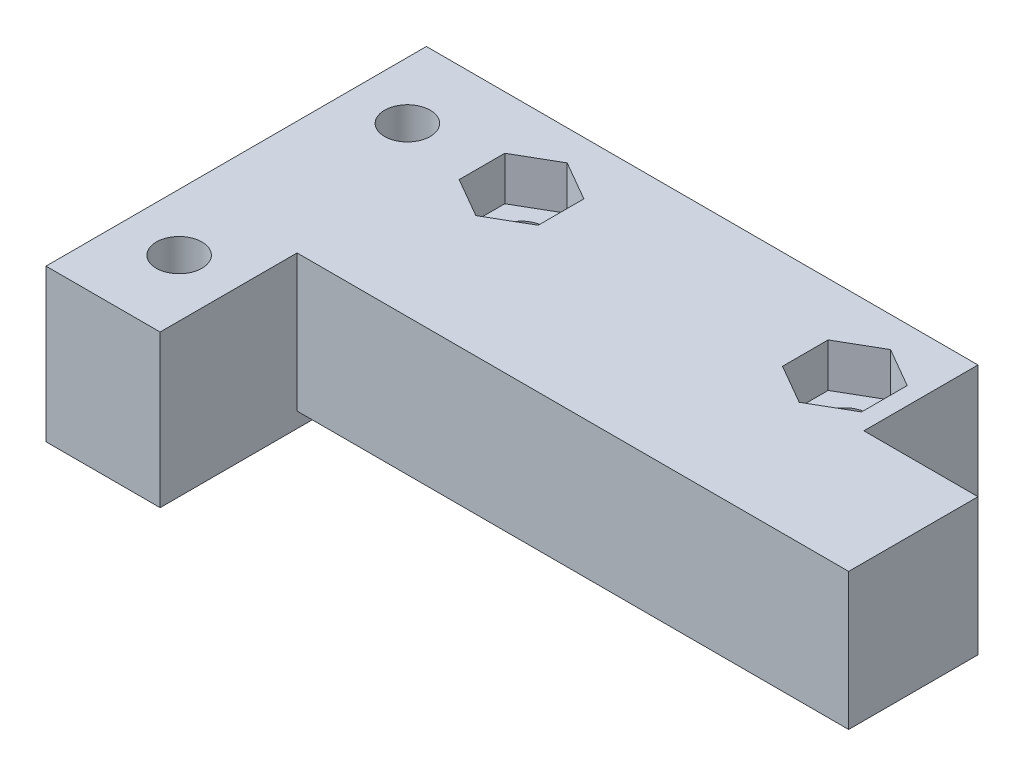
ISO-10303-21;
HEADER;
FILE_DESCRIPTION(('STEP AP214'),'2;1');
FILE_NAME('part.step','',(''),(''),'','','');
FILE_SCHEMA(('AUTOMOTIVE_DESIGN { 1 0 10303 214 1 1 1 1 }'));
ENDSEC;
DATA;
#1=APPLICATION_CONTEXT('core data for automotive mechanical design processes');
#2=APPLICATION_PROTOCOL_DEFINITION('international standard','automotive_design',2000,#1);
#3=PRODUCT_CONTEXT('',#1,'mechanical');
#4=PRODUCT('Part','Part','',(#3));
#5=PRODUCT_RELATED_PRODUCT_CATEGORY('part','',(#4));
#6=PRODUCT_DEFINITION_FORMATION('','',#4);
#7=PRODUCT_DEFINITION_CONTEXT('part definition',#1,'design');
#8=PRODUCT_DEFINITION('design','',#6,#7);
#9=PRODUCT_DEFINITION_SHAPE('','',#8);
#10=(LENGTH_UNIT() NAMED_UNIT(*) SI_UNIT(.MILLI.,.METRE.));
#11=(NAMED_UNIT(*) PLANE_ANGLE_UNIT() SI_UNIT($,.RADIAN.));
#12=(NAMED_UNIT(*) SI_UNIT($,.STERADIAN.) SOLID_ANGLE_UNIT());
#13=UNCERTAINTY_MEASURE_WITH_UNIT(LENGTH_MEASURE(1.E-05),#10,'distance_accuracy_value','');
#14=(GEOMETRIC_REPRESENTATION_CONTEXT(3) GLOBAL_UNCERTAINTY_ASSIGNED_CONTEXT((#13)) GLOBAL_UNIT_ASSIGNED_CONTEXT((#10,
#11,#12)) REPRESENTATION_CONTEXT('',''));
#15=CARTESIAN_POINT('',(0.,0.,0.));
#16=DIRECTION('',(0.,0.,1.));
#17=DIRECTION('',(1.,0.,0.));
#18=AXIS2_PLACEMENT_3D('',#15,#16,#17);
#19=CARTESIAN_POINT('',(3.,8.,-16.));
#20=DIRECTION('',(0.,-1.,0.));
#21=DIRECTION('',(0.,0.,-1.));
#22=AXIS2_PLACEMENT_3D('',#19,#20,#21);
#23=CYLINDRICAL_SURFACE('',#22,1.2);
#24=CARTESIAN_POINT('',(3.,8.,-16.));
#25=DIRECTION('',(0.,1.,0.));
#26=DIRECTION('',(0.,0.,1.));
#27=AXIS2_PLACEMENT_3D('',#24,#25,#26);
#28=CIRCLE('',#27,1.2);
#29=CARTESIAN_POINT('',(3.,8.,-14.8));
#30=VERTEX_POINT('',#29);
#31=EDGE_CURVE('E296',#30,#30,#28,.T.);
#32=ORIENTED_EDGE('',*,*,#31,.T.);
#33=EDGE_LOOP('',(#32));
#34=FACE_BOUND('',#33,.T.);
#35=CARTESIAN_POINT('',(3.,2.,-16.));
#36=DIRECTION('',(0.,-1.,0.));
#37=DIRECTION('',(0.,0.,-1.));
#38=AXIS2_PLACEMENT_3D('',#35,#36,#37);
#39=CIRCLE('',#38,1.2);
#40=CARTESIAN_POINT('',(3.,2.,-17.2));
#41=VERTEX_POINT('',#40);
#42=EDGE_CURVE('E37',#41,#41,#39,.T.);
#43=ORIENTED_EDGE('',*,*,#42,.T.);
#44=EDGE_LOOP('',(#43));
#45=FACE_BOUND('',#44,.T.);
#46=ADVANCED_FACE('F33',(#34,#45),#23,.F.);
#47=CARTESIAN_POINT('',(3.,8.,-4.));
#48=DIRECTION('',(0.,-1.,0.));
#49=DIRECTION('',(0.,0.,-1.));
#50=AXIS2_PLACEMENT_3D('',#47,#48,#49);
#51=CYLINDRICAL_SURFACE('',#50,1.2);
#52=CARTESIAN_POINT('',(3.,8.,-4.));
#53=DIRECTION('',(0.,1.,0.));
#54=DIRECTION('',(0.,0.,1.));
#55=AXIS2_PLACEMENT_3D('',#52,#53,#54);
#56=CIRCLE('',#55,1.2);
#57=CARTESIAN_POINT('',(3.,8.,-2.8));
#58=VERTEX_POINT('',#57);
#59=EDGE_CURVE('E293',#58,#58,#56,.T.);
#60=ORIENTED_EDGE('',*,*,#59,.T.);
#61=EDGE_LOOP('',(#60));
#62=FACE_BOUND('',#61,.T.);
#63=CARTESIAN_POINT('',(3.,2.,-4.));
#64=DIRECTION('',(0.,-1.,0.));
#65=DIRECTION('',(0.,0.,-1.));
#66=AXIS2_PLACEMENT_3D('',#63,#64,#65);
#67=CIRCLE('',#66,1.2);
#68=CARTESIAN_POINT('',(3.,2.,-5.2));
#69=VERTEX_POINT('',#68);
#70=EDGE_CURVE('E220',#69,#69,#67,.T.);
#71=ORIENTED_EDGE('',*,*,#70,.T.);
#72=EDGE_LOOP('',(#71));
#73=FACE_BOUND('',#72,.T.);
#74=ADVANCED_FACE('F404',(#62,#73),#51,.F.);
#75=CARTESIAN_POINT('',(26.,8.,-16.));
#76=DIRECTION('',(0.,-1.,0.));
#77=DIRECTION('',(0.,0.,-1.));
#78=AXIS2_PLACEMENT_3D('',#75,#76,#77);
#79=CYLINDRICAL_SURFACE('',#78,1.2);
#80=CARTESIAN_POINT('',(26.,0.,-16.));
#81=DIRECTION('',(0.,1.,0.));
#82=DIRECTION('',(0.,0.,1.));
#83=AXIS2_PLACEMENT_3D('',#80,#81,#82);
#84=CIRCLE('',#83,1.2);
#85=CARTESIAN_POINT('',(26.,0.,-14.8));
#86=VERTEX_POINT('',#85);
#87=EDGE_CURVE('E287',#86,#86,#84,.T.);
#88=ORIENTED_EDGE('',*,*,#87,.F.);
#89=EDGE_LOOP('',(#88));
#90=FACE_BOUND('',#89,.T.);
#91=CARTESIAN_POINT('',(26.,5.7,-16.));
#92=DIRECTION('',(0.,1.,0.));
#93=DIRECTION('',(0.,0.,1.));
#94=AXIS2_PLACEMENT_3D('',#91,#92,#93);
#95=CIRCLE('',#94,1.2);
#96=CARTESIAN_POINT('',(26.,5.7,-14.8));
#97=VERTEX_POINT('',#96);
#98=EDGE_CURVE('E232',#97,#97,#95,.T.);
#99=ORIENTED_EDGE('',*,*,#98,.T.);
#100=EDGE_LOOP('',(#99));
#101=FACE_BOUND('',#100,.T.);
#102=ADVANCED_FACE('F410',(#90,#101),#79,.F.);
#103=CARTESIAN_POINT('',(9.,8.,-16.));
#104=DIRECTION('',(0.,-1.,0.));
#105=DIRECTION('',(0.,0.,-1.));
#106=AXIS2_PLACEMENT_3D('',#103,#104,#105);
#107=CYLINDRICAL_SURFACE('',#106,1.2);
#108=CARTESIAN_POINT('',(9.,0.,-16.));
#109=DIRECTION('',(0.,1.,0.));
#110=DIRECTION('',(0.,0.,1.));
#111=AXIS2_PLACEMENT_3D('',#108,#109,#110);
#112=CIRCLE('',#111,1.2);
#113=CARTESIAN_POINT('',(9.,0.,-14.8));
#114=VERTEX_POINT('',#113);
#115=EDGE_CURVE('E290',#114,#114,#112,.T.);
#116=ORIENTED_EDGE('',*,*,#115,.F.);
#117=EDGE_LOOP('',(#116));
#118=FACE_BOUND('',#117,.T.);
#119=CARTESIAN_POINT('',(9.,5.7,-16.));
#120=DIRECTION('',(0.,1.,0.));
#121=DIRECTION('',(0.,0.,1.));
#122=AXIS2_PLACEMENT_3D('',#119,#120,#121);
#123=CIRCLE('',#122,1.2);
#124=CARTESIAN_POINT('',(9.,5.7,-14.8));
#125=VERTEX_POINT('',#124);
#126=EDGE_CURVE('E277',#125,#125,#123,.T.);
#127=ORIENTED_EDGE('',*,*,#126,.T.);
#128=EDGE_LOOP('',(#127));
#129=FACE_BOUND('',#128,.T.);
#130=ADVANCED_FACE('F446',(#118,#129),#107,.F.);
#131=CARTESIAN_POINT('',(0.,8.,0.));
#132=DIRECTION('',(0.,-1.,0.));
#133=DIRECTION('',(0.,0.,-1.));
#134=AXIS2_PLACEMENT_3D('',#131,#132,#133);
#135=PLANE('',#134);
#136=DIRECTION('',(-0.866025403784439,0.,0.5));
#137=VECTOR('',#136,1.);
#138=CARTESIAN_POINT('',(-1.46743371481683,8.,-2.5416697508023));
#139=LINE('',#138,#137);
#140=CARTESIAN_POINT('',(26.,8.,-18.4));
#141=VERTEX_POINT('',#140);
#142=CARTESIAN_POINT('',(23.9215390309173,8.,-17.2));
#143=VERTEX_POINT('',#142);
#144=EDGE_CURVE('E219',#141,#143,#139,.T.);
#145=ORIENTED_EDGE('',*,*,#144,.F.);
#146=DIRECTION('',(-0.866025403784439,0.,-0.499999999999999));
#147=VECTOR('',#146,1.);
#148=CARTESIAN_POINT('',(14.4674337148168,8.,-25.0583302491977));
#149=LINE('',#148,#147);
#150=CARTESIAN_POINT('',(28.0784609690827,8.,-17.2));
#151=VERTEX_POINT('',#150);
#152=EDGE_CURVE('E50',#151,#141,#149,.T.);
#153=ORIENTED_EDGE('',*,*,#152,.F.);
#154=DIRECTION('',(0.,0.,-1.));
#155=VECTOR('',#154,1.);
#156=CARTESIAN_POINT('',(28.0784609690827,8.,0.));
#157=LINE('',#156,#155);
#158=CARTESIAN_POINT('',(28.0784609690827,8.,-14.8));
#159=VERTEX_POINT('',#158);
#160=EDGE_CURVE('E202',#159,#151,#157,.T.);
#161=ORIENTED_EDGE('',*,*,#160,.F.);
#162=DIRECTION('',(0.866025403784439,0.,-0.5));
#163=VECTOR('',#162,1.);
#164=CARTESIAN_POINT('',(0.611027254265822,8.,1.05833024919771));
#165=LINE('',#164,#163);
#166=CARTESIAN_POINT('',(26.,8.,-13.6));
#167=VERTEX_POINT('',#166);
#168=EDGE_CURVE('E205',#167,#159,#165,.T.);
#169=ORIENTED_EDGE('',*,*,#168,.F.);
#170=DIRECTION('',(0.866025403784439,0.,0.499999999999999));
#171=VECTOR('',#170,1.);
#172=CARTESIAN_POINT('',(12.3889727457342,8.,-21.4583302491977));
#173=LINE('',#172,#171);
#174=CARTESIAN_POINT('',(23.9215390309173,8.,-14.8));
#175=VERTEX_POINT('',#174);
#176=EDGE_CURVE('E225',#175,#167,#173,.T.);
#177=ORIENTED_EDGE('',*,*,#176,.F.);
#178=DIRECTION('',(0.,0.,1.));
#179=VECTOR('',#178,1.);
#180=CARTESIAN_POINT('',(23.9215390309173,8.,0.));
#181=LINE('',#180,#179);
#182=EDGE_CURVE('E222',#143,#175,#181,.T.);
#183=ORIENTED_EDGE('',*,*,#182,.F.);
#184=EDGE_LOOP('',(#145,#153,#161,#169,#177,#183));
#185=FACE_BOUND('',#184,.T.);
#186=DIRECTION('',(-0.866025403784439,0.,0.5));
#187=VECTOR('',#186,1.);
#188=CARTESIAN_POINT('',(-5.71743371481683,8.,-9.90288568297003));
#189=LINE('',#188,#187);
#190=CARTESIAN_POINT('',(9.00000000000001,8.,-18.4));
#191=VERTEX_POINT('',#190);
#192=CARTESIAN_POINT('',(6.92153903091735,8.,-17.2));
#193=VERTEX_POINT('',#192);
#194=EDGE_CURVE('E261',#191,#193,#189,.T.);
#195=ORIENTED_EDGE('',*,*,#194,.F.);
#196=DIRECTION('',(-0.866025403784438,0.,-0.500000000000002));
#197=VECTOR('',#196,1.);
#198=CARTESIAN_POINT('',(10.2174337148169,8.,-17.6971143170299));
#199=LINE('',#198,#197);
#200=CARTESIAN_POINT('',(11.0784609690827,8.,-17.2));
#201=VERTEX_POINT('',#200);
#202=EDGE_CURVE('E58',#201,#191,#199,.T.);
#203=ORIENTED_EDGE('',*,*,#202,.F.);
#204=DIRECTION('',(0.,0.,-1.));
#205=VECTOR('',#204,1.);
#206=CARTESIAN_POINT('',(11.0784609690827,8.,0.));
#207=LINE('',#206,#205);
#208=CARTESIAN_POINT('',(11.0784609690827,8.,-14.8));
#209=VERTEX_POINT('',#208);
#210=EDGE_CURVE('E244',#209,#201,#207,.T.);
#211=ORIENTED_EDGE('',*,*,#210,.F.);
#212=DIRECTION('',(0.866025403784439,0.,-0.5));
#213=VECTOR('',#212,1.);
#214=CARTESIAN_POINT('',(-3.63897274573418,8.,-6.30288568297002));
#215=LINE('',#214,#213);
#216=CARTESIAN_POINT('',(9.00000000000001,8.,-13.6));
#217=VERTEX_POINT('',#216);
#218=EDGE_CURVE('E270',#217,#209,#215,.T.);
#219=ORIENTED_EDGE('',*,*,#218,.F.);
#220=DIRECTION('',(0.866025403784438,0.,0.5));
#221=VECTOR('',#220,1.);
#222=CARTESIAN_POINT('',(8.13897274573419,8.,-14.09711431703));
#223=LINE('',#222,#221);
#224=CARTESIAN_POINT('',(6.92153903091735,8.,-14.8));
#225=VERTEX_POINT('',#224);
#226=EDGE_CURVE('E267',#225,#217,#223,.T.);
#227=ORIENTED_EDGE('',*,*,#226,.F.);
#228=DIRECTION('',(0.,0.,1.));
#229=VECTOR('',#228,1.);
#230=CARTESIAN_POINT('',(6.92153903091735,8.,0.));
#231=LINE('',#230,#229);
#232=EDGE_CURVE('E264',#193,#225,#231,.T.);
#233=ORIENTED_EDGE('',*,*,#232,.F.);
#234=EDGE_LOOP('',(#195,#203,#211,#219,#227,#233));
#235=FACE_BOUND('',#234,.T.);
#236=ORIENTED_EDGE('',*,*,#31,.F.);
#237=EDGE_LOOP('',(#236));
#238=FACE_BOUND('',#237,.T.);
#239=DIRECTION('',(0.,0.,1.));
#240=VECTOR('',#239,1.);
#241=CARTESIAN_POINT('',(29.,8.,-20.));
#242=LINE('',#241,#240);
#243=CARTESIAN_POINT('',(29.,8.,-20.));
#244=VERTEX_POINT('',#243);
#245=CARTESIAN_POINT('',(29.,8.,-14.));
#246=VERTEX_POINT('',#245);
#247=EDGE_CURVE('E300',#244,#246,#242,.T.);
#248=ORIENTED_EDGE('',*,*,#247,.F.);
#249=DIRECTION('',(-1.,0.,0.));
#250=VECTOR('',#249,1.);
#251=CARTESIAN_POINT('',(0.,8.,-20.));
#252=LINE('',#251,#250);
#253=CARTESIAN_POINT('',(0.,8.,-20.));
#254=VERTEX_POINT('',#253);
#255=EDGE_CURVE('E354',#244,#254,#252,.T.);
#256=ORIENTED_EDGE('',*,*,#255,.T.);
#257=DIRECTION('',(0.,0.,1.));
#258=VECTOR('',#257,1.);
#259=CARTESIAN_POINT('',(0.,8.,0.));
#260=LINE('',#259,#258);
#261=CARTESIAN_POINT('',(0.,8.,0.));
#262=VERTEX_POINT('',#261);
#263=EDGE_CURVE('E344',#254,#262,#260,.T.);
#264=ORIENTED_EDGE('',*,*,#263,.T.);
#265=DIRECTION('',(1.,0.,0.));
#266=VECTOR('',#265,1.);
#267=CARTESIAN_POINT('',(0.,8.,0.));
#268=LINE('',#267,#266);
#269=CARTESIAN_POINT('',(6.,8.,0.));
#270=VERTEX_POINT('',#269);
#271=EDGE_CURVE('E347',#262,#270,#268,.T.);
#272=ORIENTED_EDGE('',*,*,#271,.T.);
#273=DIRECTION('',(0.,0.,1.));
#274=VECTOR('',#273,1.);
#275=CARTESIAN_POINT('',(6.,8.,0.));
#276=LINE('',#275,#274);
#277=CARTESIAN_POINT('',(6.,8.,-7.2));
#278=VERTEX_POINT('',#277);
#279=EDGE_CURVE('E313',#278,#270,#276,.T.);
#280=ORIENTED_EDGE('',*,*,#279,.F.);
#281=DIRECTION('',(-1.,0.,0.));
#282=VECTOR('',#281,1.);
#283=CARTESIAN_POINT('',(6.,8.,-7.2));
#284=LINE('',#283,#282);
#285=CARTESIAN_POINT('',(35.,8.,-7.2));
#286=VERTEX_POINT('',#285);
#287=EDGE_CURVE('E316',#286,#278,#284,.T.);
#288=ORIENTED_EDGE('',*,*,#287,.F.);
#289=DIRECTION('',(0.,0.,-1.));
#290=VECTOR('',#289,1.);
#291=CARTESIAN_POINT('',(35.,8.,0.));
#292=LINE('',#291,#290);
#293=CARTESIAN_POINT('',(35.,8.,-14.));
#294=VERTEX_POINT('',#293);
#295=EDGE_CURVE('E351',#286,#294,#292,.T.);
#296=ORIENTED_EDGE('',*,*,#295,.T.);
#297=DIRECTION('',(1.,0.,0.));
#298=VECTOR('',#297,1.);
#299=CARTESIAN_POINT('',(35.,8.,-14.));
#300=LINE('',#299,#298);
#301=EDGE_CURVE('E302',#246,#294,#300,.T.);
#302=ORIENTED_EDGE('',*,*,#301,.F.);
#303=EDGE_LOOP('',(#248,#256,#264,#272,#280,#288,#296,#302));
#304=FACE_BOUND('',#303,.T.);
#305=ORIENTED_EDGE('',*,*,#59,.F.);
#306=EDGE_LOOP('',(#305));
#307=FACE_BOUND('',#306,.T.);
#308=ADVANCED_FACE('F442',(#185,#235,#238,#304,#307),#135,.F.);
#309=CARTESIAN_POINT('',(0.,0.,0.));
#310=DIRECTION('',(0.,-1.,0.));
#311=DIRECTION('',(0.,0.,-1.));
#312=AXIS2_PLACEMENT_3D('',#309,#310,#311);
#313=PLANE('',#312);
#314=CARTESIAN_POINT('',(3.,0.,-16.));
#315=DIRECTION('',(0.,-1.,0.));
#316=DIRECTION('',(0.,0.,-1.));
#317=AXIS2_PLACEMENT_3D('',#314,#315,#316);
#318=CIRCLE('',#317,2.2);
#319=CARTESIAN_POINT('',(3.,0.,-18.2));
#320=VERTEX_POINT('',#319);
#321=EDGE_CURVE('E382',#320,#320,#318,.T.);
#322=ORIENTED_EDGE('',*,*,#321,.F.);
#323=EDGE_LOOP('',(#322));
#324=FACE_BOUND('',#323,.T.);
#325=CARTESIAN_POINT('',(3.,0.,-4.));
#326=DIRECTION('',(0.,-1.,0.));
#327=DIRECTION('',(0.,0.,-1.));
#328=AXIS2_PLACEMENT_3D('',#325,#326,#327);
#329=CIRCLE('',#328,2.2);
#330=CARTESIAN_POINT('',(3.,0.,-6.2));
#331=VERTEX_POINT('',#330);
#332=EDGE_CURVE('E208',#331,#331,#329,.T.);
#333=ORIENTED_EDGE('',*,*,#332,.F.);
#334=EDGE_LOOP('',(#333));
#335=FACE_BOUND('',#334,.T.);
#336=ORIENTED_EDGE('',*,*,#115,.T.);
#337=EDGE_LOOP('',(#336));
#338=FACE_BOUND('',#337,.T.);
#339=DIRECTION('',(-1.,0.,0.));
#340=VECTOR('',#339,1.);
#341=CARTESIAN_POINT('',(0.,0.,-20.));
#342=LINE('',#341,#340);
#343=CARTESIAN_POINT('',(29.,0.,-20.));
#344=VERTEX_POINT('',#343);
#345=CARTESIAN_POINT('',(0.,0.,-20.));
#346=VERTEX_POINT('',#345);
#347=EDGE_CURVE('E348',#344,#346,#342,.T.);
#348=ORIENTED_EDGE('',*,*,#347,.F.);
#349=DIRECTION('',(0.,0.,1.));
#350=VECTOR('',#349,1.);
#351=CARTESIAN_POINT('',(29.,0.,-20.));
#352=LINE('',#351,#350);
#353=CARTESIAN_POINT('',(29.,0.,-14.));
#354=VERTEX_POINT('',#353);
#355=EDGE_CURVE('E299',#344,#354,#352,.T.);
#356=ORIENTED_EDGE('',*,*,#355,.T.);
#357=DIRECTION('',(-1.,0.,0.));
#358=VECTOR('',#357,1.);
#359=CARTESIAN_POINT('',(6.,0.,-14.));
#360=LINE('',#359,#358);
#361=CARTESIAN_POINT('',(6.,0.,-14.));
#362=VERTEX_POINT('',#361);
#363=EDGE_CURVE('E328',#354,#362,#360,.T.);
#364=ORIENTED_EDGE('',*,*,#363,.T.);
#365=DIRECTION('',(0.,0.,1.));
#366=VECTOR('',#365,1.);
#367=CARTESIAN_POINT('',(6.,0.,0.));
#368=LINE('',#367,#366);
#369=CARTESIAN_POINT('',(6.,0.,0.));
#370=VERTEX_POINT('',#369);
#371=EDGE_CURVE('E323',#362,#370,#368,.T.);
#372=ORIENTED_EDGE('',*,*,#371,.T.);
#373=DIRECTION('',(1.,0.,0.));
#374=VECTOR('',#373,1.);
#375=CARTESIAN_POINT('',(0.,0.,0.));
#376=LINE('',#375,#374);
#377=CARTESIAN_POINT('',(0.,0.,0.));
#378=VERTEX_POINT('',#377);
#379=EDGE_CURVE('E359',#378,#370,#376,.T.);
#380=ORIENTED_EDGE('',*,*,#379,.F.);
#381=DIRECTION('',(0.,0.,1.));
#382=VECTOR('',#381,1.);
#383=CARTESIAN_POINT('',(0.,0.,0.));
#384=LINE('',#383,#382);
#385=EDGE_CURVE('E343',#346,#378,#384,.T.);
#386=ORIENTED_EDGE('',*,*,#385,.F.);
#387=EDGE_LOOP('',(#348,#356,#364,#372,#380,#386));
#388=FACE_BOUND('',#387,.T.);
#389=ORIENTED_EDGE('',*,*,#87,.T.);
#390=EDGE_LOOP('',(#389));
#391=FACE_BOUND('',#390,.T.);
#392=ADVANCED_FACE('F445',(#324,#335,#338,#388,#391),#313,.T.);
#393=CARTESIAN_POINT('',(35.,8.,0.));
#394=DIRECTION('',(-1.,0.,0.));
#395=DIRECTION('',(0.,0.,1.));
#396=AXIS2_PLACEMENT_3D('',#393,#394,#395);
#397=PLANE('',#396);
#398=DIRECTION('',(0.,-1.,0.));
#399=VECTOR('',#398,1.);
#400=CARTESIAN_POINT('',(35.,8.,-14.));
#401=LINE('',#400,#399);
#402=CARTESIAN_POINT('',(35.,0.8,-14.));
#403=VERTEX_POINT('',#402);
#404=EDGE_CURVE('E304',#294,#403,#401,.T.);
#405=ORIENTED_EDGE('',*,*,#404,.F.);
#406=ORIENTED_EDGE('',*,*,#295,.F.);
#407=DIRECTION('',(0.,-1.,0.));
#408=VECTOR('',#407,1.);
#409=CARTESIAN_POINT('',(35.,8.,-7.2));
#410=LINE('',#409,#408);
#411=CARTESIAN_POINT('',(35.,0.8,-7.2));
#412=VERTEX_POINT('',#411);
#413=EDGE_CURVE('E320',#286,#412,#410,.T.);
#414=ORIENTED_EDGE('',*,*,#413,.T.);
#415=DIRECTION('',(0.,0.,-1.));
#416=VECTOR('',#415,1.);
#417=CARTESIAN_POINT('',(35.,0.8,0.));
#418=LINE('',#417,#416);
#419=EDGE_CURVE('E327',#412,#403,#418,.T.);
#420=ORIENTED_EDGE('',*,*,#419,.T.);
#421=EDGE_LOOP('',(#405,#406,#414,#420));
#422=FACE_BOUND('',#421,.T.);
#423=ADVANCED_FACE('F450',(#422),#397,.F.);
#424=CARTESIAN_POINT('',(0.,8.,-20.));
#425=DIRECTION('',(0.,0.,1.));
#426=DIRECTION('',(1.,0.,0.));
#427=AXIS2_PLACEMENT_3D('',#424,#425,#426);
#428=PLANE('',#427);
#429=DIRECTION('',(0.,-1.,0.));
#430=VECTOR('',#429,1.);
#431=CARTESIAN_POINT('',(29.,8.,-20.));
#432=LINE('',#431,#430);
#433=EDGE_CURVE('E310',#244,#344,#432,.T.);
#434=ORIENTED_EDGE('',*,*,#433,.T.);
#435=ORIENTED_EDGE('',*,*,#347,.T.);
#436=DIRECTION('',(0.,-1.,0.));
#437=VECTOR('',#436,1.);
#438=CARTESIAN_POINT('',(0.,8.,-20.));
#439=LINE('',#438,#437);
#440=EDGE_CURVE('E356',#254,#346,#439,.T.);
#441=ORIENTED_EDGE('',*,*,#440,.F.);
#442=ORIENTED_EDGE('',*,*,#255,.F.);
#443=EDGE_LOOP('',(#434,#435,#441,#442));
#444=FACE_BOUND('',#443,.T.);
#445=ADVANCED_FACE('F437',(#444),#428,.F.);
#446=CARTESIAN_POINT('',(6.,0.8,-14.));
#447=DIRECTION('',(0.,0.,1.));
#448=DIRECTION('',(1.,0.,0.));
#449=AXIS2_PLACEMENT_3D('',#446,#447,#448);
#450=PLANE('',#449);
#451=ORIENTED_EDGE('',*,*,#363,.F.);
#452=DIRECTION('',(0.,1.,0.));
#453=VECTOR('',#452,1.);
#454=CARTESIAN_POINT('',(29.,0.8,-14.));
#455=LINE('',#454,#453);
#456=CARTESIAN_POINT('',(29.,0.8,-14.));
#457=VERTEX_POINT('',#456);
#458=EDGE_CURVE('E11',#354,#457,#455,.T.);
#459=ORIENTED_EDGE('',*,*,#458,.T.);
#460=DIRECTION('',(-1.,0.,0.));
#461=VECTOR('',#460,1.);
#462=CARTESIAN_POINT('',(6.,0.8,-14.));
#463=LINE('',#462,#461);
#464=CARTESIAN_POINT('',(6.,0.8,-14.));
#465=VERTEX_POINT('',#464);
#466=EDGE_CURVE('E331',#457,#465,#463,.T.);
#467=ORIENTED_EDGE('',*,*,#466,.T.);
#468=DIRECTION('',(0.,-1.,0.));
#469=VECTOR('',#468,1.);
#470=CARTESIAN_POINT('',(6.,0.8,-14.));
#471=LINE('',#470,#469);
#472=EDGE_CURVE('E335',#465,#362,#471,.T.);
#473=ORIENTED_EDGE('',*,*,#472,.T.);
#474=EDGE_LOOP('',(#451,#459,#467,#473));
#475=FACE_BOUND('',#474,.T.);
#476=ADVANCED_FACE('F434',(#475),#450,.T.);
#477=CARTESIAN_POINT('',(0.,8.,0.));
#478=DIRECTION('',(0.,0.,-1.));
#479=DIRECTION('',(-1.,0.,0.));
#480=AXIS2_PLACEMENT_3D('',#477,#478,#479);
#481=PLANE('',#480);
#482=DIRECTION('',(0.,-1.,0.));
#483=VECTOR('',#482,1.);
#484=CARTESIAN_POINT('',(6.,0.8,0.));
#485=LINE('',#484,#483);
#486=EDGE_CURVE('E340',#270,#370,#485,.T.);
#487=ORIENTED_EDGE('',*,*,#486,.F.);
#488=ORIENTED_EDGE('',*,*,#271,.F.);
#489=DIRECTION('',(0.,-1.,0.));
#490=VECTOR('',#489,1.);
#491=CARTESIAN_POINT('',(0.,8.,0.));
#492=LINE('',#491,#490);
#493=EDGE_CURVE('E365',#262,#378,#492,.T.);
#494=ORIENTED_EDGE('',*,*,#493,.T.);
#495=ORIENTED_EDGE('',*,*,#379,.T.);
#496=EDGE_LOOP('',(#487,#488,#494,#495));
#497=FACE_BOUND('',#496,.T.);
#498=ADVANCED_FACE('F432',(#497),#481,.F.);
#499=CARTESIAN_POINT('',(0.,0.8,0.));
#500=DIRECTION('',(0.,-1.,0.));
#501=DIRECTION('',(0.,0.,-1.));
#502=AXIS2_PLACEMENT_3D('',#499,#500,#501);
#503=PLANE('',#502);
#504=ORIENTED_EDGE('',*,*,#419,.F.);
#505=DIRECTION('',(-1.,0.,0.));
#506=VECTOR('',#505,1.);
#507=CARTESIAN_POINT('',(0.,0.8,-7.2));
#508=LINE('',#507,#506);
#509=CARTESIAN_POINT('',(6.,0.8,-7.2));
#510=VERTEX_POINT('',#509);
#511=EDGE_CURVE('E42',#412,#510,#508,.T.);
#512=ORIENTED_EDGE('',*,*,#511,.T.);
#513=DIRECTION('',(0.,0.,1.));
#514=VECTOR('',#513,1.);
#515=CARTESIAN_POINT('',(6.,0.8,0.));
#516=LINE('',#515,#514);
#517=EDGE_CURVE('E324',#465,#510,#516,.T.);
#518=ORIENTED_EDGE('',*,*,#517,.F.);
#519=ORIENTED_EDGE('',*,*,#466,.F.);
#520=EDGE_CURVE('E332',#403,#457,#463,.T.);
#521=ORIENTED_EDGE('',*,*,#520,.F.);
#522=EDGE_LOOP('',(#504,#512,#518,#519,#521));
#523=FACE_BOUND('',#522,.T.);
#524=ADVANCED_FACE('F429',(#523),#503,.T.);
#525=CARTESIAN_POINT('',(0.,8.,0.));
#526=DIRECTION('',(1.,0.,0.));
#527=DIRECTION('',(0.,0.,-1.));
#528=AXIS2_PLACEMENT_3D('',#525,#526,#527);
#529=PLANE('',#528);
#530=ORIENTED_EDGE('',*,*,#385,.T.);
#531=ORIENTED_EDGE('',*,*,#493,.F.);
#532=ORIENTED_EDGE('',*,*,#263,.F.);
#533=ORIENTED_EDGE('',*,*,#440,.T.);
#534=EDGE_LOOP('',(#530,#531,#532,#533));
#535=FACE_BOUND('',#534,.T.);
#536=ADVANCED_FACE('F35',(#535),#529,.F.);
#537=CARTESIAN_POINT('',(6.,0.8,0.));
#538=DIRECTION('',(1.,0.,0.));
#539=DIRECTION('',(0.,0.,-1.));
#540=AXIS2_PLACEMENT_3D('',#537,#538,#539);
#541=PLANE('',#540);
#542=ORIENTED_EDGE('',*,*,#486,.T.);
#543=ORIENTED_EDGE('',*,*,#371,.F.);
#544=ORIENTED_EDGE('',*,*,#472,.F.);
#545=ORIENTED_EDGE('',*,*,#517,.T.);
#546=DIRECTION('',(0.,-1.,0.));
#547=VECTOR('',#546,1.);
#548=CARTESIAN_POINT('',(6.,8.,-7.2));
#549=LINE('',#548,#547);
#550=EDGE_CURVE('E318',#278,#510,#549,.T.);
#551=ORIENTED_EDGE('',*,*,#550,.F.);
#552=ORIENTED_EDGE('',*,*,#279,.T.);
#553=EDGE_LOOP('',(#542,#543,#544,#545,#551,#552));
#554=FACE_BOUND('',#553,.T.);
#555=ADVANCED_FACE('F427',(#554),#541,.T.);
#556=CARTESIAN_POINT('',(6.,8.,-7.2));
#557=DIRECTION('',(0.,0.,1.));
#558=DIRECTION('',(1.,0.,0.));
#559=AXIS2_PLACEMENT_3D('',#556,#557,#558);
#560=PLANE('',#559);
#561=ORIENTED_EDGE('',*,*,#413,.F.);
#562=ORIENTED_EDGE('',*,*,#287,.T.);
#563=ORIENTED_EDGE('',*,*,#550,.T.);
#564=ORIENTED_EDGE('',*,*,#511,.F.);
#565=EDGE_LOOP('',(#561,#562,#563,#564));
#566=FACE_BOUND('',#565,.T.);
#567=ADVANCED_FACE('F423',(#566),#560,.T.);
#568=CARTESIAN_POINT('',(29.,8.,-20.));
#569=DIRECTION('',(1.,0.,0.));
#570=DIRECTION('',(0.,0.,-1.));
#571=AXIS2_PLACEMENT_3D('',#568,#569,#570);
#572=PLANE('',#571);
#573=ORIENTED_EDGE('',*,*,#355,.F.);
#574=ORIENTED_EDGE('',*,*,#433,.F.);
#575=ORIENTED_EDGE('',*,*,#247,.T.);
#576=DIRECTION('',(0.,-1.,0.));
#577=VECTOR('',#576,1.);
#578=CARTESIAN_POINT('',(29.,8.,-14.));
#579=LINE('',#578,#577);
#580=EDGE_CURVE('E308',#246,#457,#579,.T.);
#581=ORIENTED_EDGE('',*,*,#580,.T.);
#582=ORIENTED_EDGE('',*,*,#458,.F.);
#583=EDGE_LOOP('',(#573,#574,#575,#581,#582));
#584=FACE_BOUND('',#583,.T.);
#585=ADVANCED_FACE('F419',(#584),#572,.T.);
#586=CARTESIAN_POINT('',(35.,8.,-14.));
#587=DIRECTION('',(0.,0.,-1.));
#588=DIRECTION('',(-1.,0.,0.));
#589=AXIS2_PLACEMENT_3D('',#586,#587,#588);
#590=PLANE('',#589);
#591=ORIENTED_EDGE('',*,*,#580,.F.);
#592=ORIENTED_EDGE('',*,*,#301,.T.);
#593=ORIENTED_EDGE('',*,*,#404,.T.);
#594=ORIENTED_EDGE('',*,*,#520,.T.);
#595=EDGE_LOOP('',(#591,#592,#593,#594));
#596=FACE_BOUND('',#595,.T.);
#597=ADVANCED_FACE('F415',(#596),#590,.T.);
#598=CARTESIAN_POINT('',(10.2174337148169,5.7,-17.6971143170299));
#599=DIRECTION('',(0.500000000000002,0.,-0.866025403784438));
#600=DIRECTION('',(-0.866025403784438,0.,-0.500000000000002));
#601=AXIS2_PLACEMENT_3D('',#598,#599,#600);
#602=PLANE('',#601);
#603=ORIENTED_EDGE('',*,*,#202,.T.);
#604=DIRECTION('',(0.,1.,0.));
#605=VECTOR('',#604,1.);
#606=CARTESIAN_POINT('',(9.00000000000001,5.7,-18.4));
#607=LINE('',#606,#605);
#608=CARTESIAN_POINT('',(9.00000000000001,5.7,-18.4));
#609=VERTEX_POINT('',#608);
#610=EDGE_CURVE('E259',#609,#191,#607,.T.);
#611=ORIENTED_EDGE('',*,*,#610,.F.);
#612=DIRECTION('',(-0.866025403784438,0.,-0.500000000000002));
#613=VECTOR('',#612,1.);
#614=CARTESIAN_POINT('',(10.2174337148169,5.7,-17.6971143170299));
#615=LINE('',#614,#613);
#616=CARTESIAN_POINT('',(11.0784609690827,5.7,-17.2));
#617=VERTEX_POINT('',#616);
#618=EDGE_CURVE('E240',#617,#609,#615,.T.);
#619=ORIENTED_EDGE('',*,*,#618,.F.);
#620=DIRECTION('',(0.,1.,0.));
#621=VECTOR('',#620,1.);
#622=CARTESIAN_POINT('',(11.0784609690827,5.7,-17.2));
#623=LINE('',#622,#621);
#624=EDGE_CURVE('E275',#617,#201,#623,.T.);
#625=ORIENTED_EDGE('',*,*,#624,.T.);
#626=EDGE_LOOP('',(#603,#611,#619,#625));
#627=FACE_BOUND('',#626,.T.);
#628=ADVANCED_FACE('F418',(#627),#602,.F.);
#629=CARTESIAN_POINT('',(11.0784609690827,5.7,0.));
#630=DIRECTION('',(1.,0.,0.));
#631=DIRECTION('',(0.,0.,-1.));
#632=AXIS2_PLACEMENT_3D('',#629,#630,#631);
#633=PLANE('',#632);
#634=ORIENTED_EDGE('',*,*,#210,.T.);
#635=ORIENTED_EDGE('',*,*,#624,.F.);
#636=DIRECTION('',(0.,0.,-1.));
#637=VECTOR('',#636,1.);
#638=CARTESIAN_POINT('',(11.0784609690827,5.7,0.));
#639=LINE('',#638,#637);
#640=CARTESIAN_POINT('',(11.0784609690827,5.7,-14.8));
#641=VERTEX_POINT('',#640);
#642=EDGE_CURVE('E256',#641,#617,#639,.T.);
#643=ORIENTED_EDGE('',*,*,#642,.F.);
#644=DIRECTION('',(0.,1.,0.));
#645=VECTOR('',#644,1.);
#646=CARTESIAN_POINT('',(11.0784609690827,5.7,-14.8));
#647=LINE('',#646,#645);
#648=EDGE_CURVE('E278',#641,#209,#647,.T.);
#649=ORIENTED_EDGE('',*,*,#648,.T.);
#650=EDGE_LOOP('',(#634,#635,#643,#649));
#651=FACE_BOUND('',#650,.T.);
#652=ADVANCED_FACE('F529',(#651),#633,.F.);
#653=CARTESIAN_POINT('',(-3.63897274573418,5.7,-6.30288568297002));
#654=DIRECTION('',(0.5,0.,0.866025403784439));
#655=DIRECTION('',(0.866025403784438,0.,-0.5));
#656=AXIS2_PLACEMENT_3D('',#653,#654,#655);
#657=PLANE('',#656);
#658=ORIENTED_EDGE('',*,*,#218,.T.);
#659=ORIENTED_EDGE('',*,*,#648,.F.);
#660=DIRECTION('',(0.866025403784439,0.,-0.5));
#661=VECTOR('',#660,1.);
#662=CARTESIAN_POINT('',(-3.63897274573418,5.7,-6.30288568297002));
#663=LINE('',#662,#661);
#664=CARTESIAN_POINT('',(9.00000000000001,5.7,-13.6));
#665=VERTEX_POINT('',#664);
#666=EDGE_CURVE('E253',#665,#641,#663,.T.);
#667=ORIENTED_EDGE('',*,*,#666,.F.);
#668=DIRECTION('',(0.,1.,0.));
#669=VECTOR('',#668,1.);
#670=CARTESIAN_POINT('',(9.00000000000001,5.7,-13.6));
#671=LINE('',#670,#669);
#672=EDGE_CURVE('E280',#665,#217,#671,.T.);
#673=ORIENTED_EDGE('',*,*,#672,.T.);
#674=EDGE_LOOP('',(#658,#659,#667,#673));
#675=FACE_BOUND('',#674,.T.);
#676=ADVANCED_FACE('F532',(#675),#657,.F.);
#677=CARTESIAN_POINT('',(8.13897274573419,5.7,-14.09711431703));
#678=DIRECTION('',(-0.5,0.,0.866025403784438));
#679=DIRECTION('',(0.866025403784438,0.,0.5));
#680=AXIS2_PLACEMENT_3D('',#677,#678,#679);
#681=PLANE('',#680);
#682=ORIENTED_EDGE('',*,*,#226,.T.);
#683=ORIENTED_EDGE('',*,*,#672,.F.);
#684=DIRECTION('',(0.866025403784438,0.,0.5));
#685=VECTOR('',#684,1.);
#686=CARTESIAN_POINT('',(8.13897274573419,5.7,-14.09711431703));
#687=LINE('',#686,#685);
#688=CARTESIAN_POINT('',(6.92153903091735,5.7,-14.8));
#689=VERTEX_POINT('',#688);
#690=EDGE_CURVE('E250',#689,#665,#687,.T.);
#691=ORIENTED_EDGE('',*,*,#690,.F.);
#692=DIRECTION('',(0.,1.,0.));
#693=VECTOR('',#692,1.);
#694=CARTESIAN_POINT('',(6.92153903091735,5.7,-14.8));
#695=LINE('',#694,#693);
#696=EDGE_CURVE('E282',#689,#225,#695,.T.);
#697=ORIENTED_EDGE('',*,*,#696,.T.);
#698=EDGE_LOOP('',(#682,#683,#691,#697));
#699=FACE_BOUND('',#698,.T.);
#700=ADVANCED_FACE('F536',(#699),#681,.F.);
#701=CARTESIAN_POINT('',(6.92153903091735,5.7,0.));
#702=DIRECTION('',(-1.,0.,0.));
#703=DIRECTION('',(0.,0.,1.));
#704=AXIS2_PLACEMENT_3D('',#701,#702,#703);
#705=PLANE('',#704);
#706=ORIENTED_EDGE('',*,*,#232,.T.);
#707=ORIENTED_EDGE('',*,*,#696,.F.);
#708=DIRECTION('',(0.,0.,1.));
#709=VECTOR('',#708,1.);
#710=CARTESIAN_POINT('',(6.92153903091735,5.7,0.));
#711=LINE('',#710,#709);
#712=CARTESIAN_POINT('',(6.92153903091735,5.7,-17.2));
#713=VERTEX_POINT('',#712);
#714=EDGE_CURVE('E247',#713,#689,#711,.T.);
#715=ORIENTED_EDGE('',*,*,#714,.F.);
#716=DIRECTION('',(0.,1.,0.));
#717=VECTOR('',#716,1.);
#718=CARTESIAN_POINT('',(6.92153903091735,5.7,-17.2));
#719=LINE('',#718,#717);
#720=EDGE_CURVE('E284',#713,#193,#719,.T.);
#721=ORIENTED_EDGE('',*,*,#720,.T.);
#722=EDGE_LOOP('',(#706,#707,#715,#721));
#723=FACE_BOUND('',#722,.T.);
#724=ADVANCED_FACE('F540',(#723),#705,.F.);
#725=CARTESIAN_POINT('',(-5.71743371481683,5.7,-9.90288568297003));
#726=DIRECTION('',(-0.5,0.,-0.866025403784439));
#727=DIRECTION('',(-0.866025403784439,0.,0.5));
#728=AXIS2_PLACEMENT_3D('',#725,#726,#727);
#729=PLANE('',#728);
#730=ORIENTED_EDGE('',*,*,#194,.T.);
#731=ORIENTED_EDGE('',*,*,#720,.F.);
#732=DIRECTION('',(-0.866025403784439,0.,0.5));
#733=VECTOR('',#732,1.);
#734=CARTESIAN_POINT('',(-5.71743371481683,5.7,-9.90288568297003));
#735=LINE('',#734,#733);
#736=EDGE_CURVE('E243',#609,#713,#735,.T.);
#737=ORIENTED_EDGE('',*,*,#736,.F.);
#738=ORIENTED_EDGE('',*,*,#610,.T.);
#739=EDGE_LOOP('',(#730,#731,#737,#738));
#740=FACE_BOUND('',#739,.T.);
#741=ADVANCED_FACE('F527',(#740),#729,.F.);
#742=CARTESIAN_POINT('',(0.,5.7,0.));
#743=DIRECTION('',(0.,1.,0.));
#744=DIRECTION('',(0.,0.,1.));
#745=AXIS2_PLACEMENT_3D('',#742,#743,#744);
#746=PLANE('',#745);
#747=ORIENTED_EDGE('',*,*,#126,.F.);
#748=EDGE_LOOP('',(#747));
#749=FACE_BOUND('',#748,.T.);
#750=ORIENTED_EDGE('',*,*,#618,.T.);
#751=ORIENTED_EDGE('',*,*,#736,.T.);
#752=ORIENTED_EDGE('',*,*,#714,.T.);
#753=ORIENTED_EDGE('',*,*,#690,.T.);
#754=ORIENTED_EDGE('',*,*,#666,.T.);
#755=ORIENTED_EDGE('',*,*,#642,.T.);
#756=EDGE_LOOP('',(#750,#751,#752,#753,#754,#755));
#757=FACE_BOUND('',#756,.T.);
#758=ADVANCED_FACE('F524',(#749,#757),#746,.T.);
#759=CARTESIAN_POINT('',(14.4674337148168,5.7,-25.0583302491977));
#760=DIRECTION('',(0.499999999999999,0.,-0.866025403784439));
#761=DIRECTION('',(-0.866025403784439,0.,-0.499999999999999));
#762=AXIS2_PLACEMENT_3D('',#759,#760,#761);
#763=PLANE('',#762);
#764=ORIENTED_EDGE('',*,*,#152,.T.);
#765=DIRECTION('',(0.,1.,0.));
#766=VECTOR('',#765,1.);
#767=CARTESIAN_POINT('',(26.,5.7,-18.4));
#768=LINE('',#767,#766);
#769=CARTESIAN_POINT('',(26.,5.7,-18.4));
#770=VERTEX_POINT('',#769);
#771=EDGE_CURVE('E179',#770,#141,#768,.T.);
#772=ORIENTED_EDGE('',*,*,#771,.F.);
#773=DIRECTION('',(-0.866025403784439,0.,-0.499999999999999));
#774=VECTOR('',#773,1.);
#775=CARTESIAN_POINT('',(14.4674337148168,5.7,-25.0583302491977));
#776=LINE('',#775,#774);
#777=CARTESIAN_POINT('',(28.0784609690827,5.7,-17.2));
#778=VERTEX_POINT('',#777);
#779=EDGE_CURVE('E183',#778,#770,#776,.T.);
#780=ORIENTED_EDGE('',*,*,#779,.F.);
#781=DIRECTION('',(0.,1.,0.));
#782=VECTOR('',#781,1.);
#783=CARTESIAN_POINT('',(28.0784609690827,5.7,-17.2));
#784=LINE('',#783,#782);
#785=EDGE_CURVE('E230',#778,#151,#784,.T.);
#786=ORIENTED_EDGE('',*,*,#785,.T.);
#787=EDGE_LOOP('',(#764,#772,#780,#786));
#788=FACE_BOUND('',#787,.T.);
#789=ADVANCED_FACE('F181',(#788),#763,.F.);
#790=CARTESIAN_POINT('',(28.0784609690827,5.7,0.));
#791=DIRECTION('',(1.,0.,0.));
#792=DIRECTION('',(0.,0.,-1.));
#793=AXIS2_PLACEMENT_3D('',#790,#791,#792);
#794=PLANE('',#793);
#795=ORIENTED_EDGE('',*,*,#160,.T.);
#796=ORIENTED_EDGE('',*,*,#785,.F.);
#797=DIRECTION('',(0.,0.,-1.));
#798=VECTOR('',#797,1.);
#799=CARTESIAN_POINT('',(28.0784609690827,5.7,0.));
#800=LINE('',#799,#798);
#801=CARTESIAN_POINT('',(28.0784609690827,5.7,-14.8));
#802=VERTEX_POINT('',#801);
#803=EDGE_CURVE('E189',#802,#778,#800,.T.);
#804=ORIENTED_EDGE('',*,*,#803,.F.);
#805=DIRECTION('',(0.,1.,0.));
#806=VECTOR('',#805,1.);
#807=CARTESIAN_POINT('',(28.0784609690827,5.7,-14.8));
#808=LINE('',#807,#806);
#809=EDGE_CURVE('E233',#802,#159,#808,.T.);
#810=ORIENTED_EDGE('',*,*,#809,.T.);
#811=EDGE_LOOP('',(#795,#796,#804,#810));
#812=FACE_BOUND('',#811,.T.);
#813=ADVANCED_FACE('F507',(#812),#794,.F.);
#814=CARTESIAN_POINT('',(0.611027254265822,5.7,1.05833024919771));
#815=DIRECTION('',(0.5,0.,0.866025403784439));
#816=DIRECTION('',(0.866025403784438,0.,-0.5));
#817=AXIS2_PLACEMENT_3D('',#814,#815,#816);
#818=PLANE('',#817);
#819=ORIENTED_EDGE('',*,*,#168,.T.);
#820=ORIENTED_EDGE('',*,*,#809,.F.);
#821=DIRECTION('',(0.866025403784439,0.,-0.5));
#822=VECTOR('',#821,1.);
#823=CARTESIAN_POINT('',(0.611027254265822,5.7,1.05833024919771));
#824=LINE('',#823,#822);
#825=CARTESIAN_POINT('',(26.,5.7,-13.6));
#826=VERTEX_POINT('',#825);
#827=EDGE_CURVE('E215',#826,#802,#824,.T.);
#828=ORIENTED_EDGE('',*,*,#827,.F.);
#829=DIRECTION('',(0.,1.,0.));
#830=VECTOR('',#829,1.);
#831=CARTESIAN_POINT('',(26.,5.7,-13.6));
#832=LINE('',#831,#830);
#833=EDGE_CURVE('E235',#826,#167,#832,.T.);
#834=ORIENTED_EDGE('',*,*,#833,.T.);
#835=EDGE_LOOP('',(#819,#820,#828,#834));
#836=FACE_BOUND('',#835,.T.);
#837=ADVANCED_FACE('F510',(#836),#818,.F.);
#838=CARTESIAN_POINT('',(12.3889727457342,5.7,-21.4583302491977));
#839=DIRECTION('',(-0.499999999999999,0.,0.866025403784439));
#840=DIRECTION('',(0.866025403784439,0.,0.499999999999999));
#841=AXIS2_PLACEMENT_3D('',#838,#839,#840);
#842=PLANE('',#841);
#843=ORIENTED_EDGE('',*,*,#176,.T.);
#844=ORIENTED_EDGE('',*,*,#833,.F.);
#845=DIRECTION('',(0.866025403784439,0.,0.499999999999999));
#846=VECTOR('',#845,1.);
#847=CARTESIAN_POINT('',(12.3889727457342,5.7,-21.4583302491977));
#848=LINE('',#847,#846);
#849=CARTESIAN_POINT('',(23.9215390309173,5.7,-14.8));
#850=VERTEX_POINT('',#849);
#851=EDGE_CURVE('E212',#850,#826,#848,.T.);
#852=ORIENTED_EDGE('',*,*,#851,.F.);
#853=DIRECTION('',(0.,1.,0.));
#854=VECTOR('',#853,1.);
#855=CARTESIAN_POINT('',(23.9215390309173,5.7,-14.8));
#856=LINE('',#855,#854);
#857=EDGE_CURVE('E237',#850,#175,#856,.T.);
#858=ORIENTED_EDGE('',*,*,#857,.T.);
#859=EDGE_LOOP('',(#843,#844,#852,#858));
#860=FACE_BOUND('',#859,.T.);
#861=ADVANCED_FACE('F514',(#860),#842,.F.);
#862=CARTESIAN_POINT('',(23.9215390309173,5.7,0.));
#863=DIRECTION('',(-1.,0.,0.));
#864=DIRECTION('',(0.,0.,1.));
#865=AXIS2_PLACEMENT_3D('',#862,#863,#864);
#866=PLANE('',#865);
#867=ORIENTED_EDGE('',*,*,#182,.T.);
#868=ORIENTED_EDGE('',*,*,#857,.F.);
#869=DIRECTION('',(0.,0.,1.));
#870=VECTOR('',#869,1.);
#871=CARTESIAN_POINT('',(23.9215390309173,5.7,0.));
#872=LINE('',#871,#870);
#873=CARTESIAN_POINT('',(23.9215390309173,5.7,-17.2));
#874=VERTEX_POINT('',#873);
#875=EDGE_CURVE('E197',#874,#850,#872,.T.);
#876=ORIENTED_EDGE('',*,*,#875,.F.);
#877=DIRECTION('',(0.,1.,0.));
#878=VECTOR('',#877,1.);
#879=CARTESIAN_POINT('',(23.9215390309173,5.7,-17.2));
#880=LINE('',#879,#878);
#881=EDGE_CURVE('E188',#874,#143,#880,.T.);
#882=ORIENTED_EDGE('',*,*,#881,.T.);
#883=EDGE_LOOP('',(#867,#868,#876,#882));
#884=FACE_BOUND('',#883,.T.);
#885=ADVANCED_FACE('F503',(#884),#866,.F.);
#886=CARTESIAN_POINT('',(-1.46743371481683,5.7,-2.5416697508023));
#887=DIRECTION('',(-0.5,0.,-0.866025403784439));
#888=DIRECTION('',(-0.866025403784439,0.,0.5));
#889=AXIS2_PLACEMENT_3D('',#886,#887,#888);
#890=PLANE('',#889);
#891=ORIENTED_EDGE('',*,*,#144,.T.);
#892=ORIENTED_EDGE('',*,*,#881,.F.);
#893=DIRECTION('',(-0.866025403784439,0.,0.5));
#894=VECTOR('',#893,1.);
#895=CARTESIAN_POINT('',(-1.46743371481683,5.7,-2.5416697508023));
#896=LINE('',#895,#894);
#897=EDGE_CURVE('E192',#770,#874,#896,.T.);
#898=ORIENTED_EDGE('',*,*,#897,.F.);
#899=ORIENTED_EDGE('',*,*,#771,.T.);
#900=EDGE_LOOP('',(#891,#892,#898,#899));
#901=FACE_BOUND('',#900,.T.);
#902=ADVANCED_FACE('F193',(#901),#890,.F.);
#903=CARTESIAN_POINT('',(0.,5.7,0.));
#904=DIRECTION('',(0.,1.,0.));
#905=DIRECTION('',(0.,0.,1.));
#906=AXIS2_PLACEMENT_3D('',#903,#904,#905);
#907=PLANE('',#906);
#908=ORIENTED_EDGE('',*,*,#98,.F.);
#909=EDGE_LOOP('',(#908));
#910=FACE_BOUND('',#909,.T.);
#911=ORIENTED_EDGE('',*,*,#779,.T.);
#912=ORIENTED_EDGE('',*,*,#897,.T.);
#913=ORIENTED_EDGE('',*,*,#875,.T.);
#914=ORIENTED_EDGE('',*,*,#851,.T.);
#915=ORIENTED_EDGE('',*,*,#827,.T.);
#916=ORIENTED_EDGE('',*,*,#803,.T.);
#917=EDGE_LOOP('',(#911,#912,#913,#914,#915,#916));
#918=FACE_BOUND('',#917,.T.);
#919=ADVANCED_FACE('F199',(#910,#918),#907,.T.);
#920=CARTESIAN_POINT('',(3.,2.,-4.));
#921=DIRECTION('',(0.,-1.,0.));
#922=DIRECTION('',(0.,0.,-1.));
#923=AXIS2_PLACEMENT_3D('',#920,#921,#922);
#924=CYLINDRICAL_SURFACE('',#923,2.2);
#925=CARTESIAN_POINT('',(3.,2.,-4.));
#926=DIRECTION('',(0.,-1.,0.));
#927=DIRECTION('',(0.,0.,-1.));
#928=AXIS2_PLACEMENT_3D('',#925,#926,#927);
#929=CIRCLE('',#928,2.2);
#930=CARTESIAN_POINT('',(3.,2.,-6.2));
#931=VERTEX_POINT('',#930);
#932=EDGE_CURVE('E374',#931,#931,#929,.T.);
#933=ORIENTED_EDGE('',*,*,#932,.F.);
#934=EDGE_LOOP('',(#933));
#935=FACE_BOUND('',#934,.T.);
#936=ORIENTED_EDGE('',*,*,#332,.T.);
#937=EDGE_LOOP('',(#936));
#938=FACE_BOUND('',#937,.T.);
#939=ADVANCED_FACE('F495',(#935,#938),#924,.F.);
#940=CARTESIAN_POINT('',(3.,2.,-4.));
#941=DIRECTION('',(0.,-1.,0.));
#942=DIRECTION('',(0.,0.,-1.));
#943=AXIS2_PLACEMENT_3D('',#940,#941,#942);
#944=PLANE('',#943);
#945=ORIENTED_EDGE('',*,*,#70,.F.);
#946=EDGE_LOOP('',(#945));
#947=FACE_BOUND('',#946,.T.);
#948=ORIENTED_EDGE('',*,*,#932,.T.);
#949=EDGE_LOOP('',(#948));
#950=FACE_BOUND('',#949,.T.);
#951=ADVANCED_FACE('F400',(#947,#950),#944,.T.);
#952=CARTESIAN_POINT('',(3.,2.,-16.));
#953=DIRECTION('',(0.,-1.,0.));
#954=DIRECTION('',(0.,0.,-1.));
#955=AXIS2_PLACEMENT_3D('',#952,#953,#954);
#956=CYLINDRICAL_SURFACE('',#955,2.2);
#957=CARTESIAN_POINT('',(3.,2.,-16.));
#958=DIRECTION('',(0.,-1.,0.));
#959=DIRECTION('',(0.,0.,-1.));
#960=AXIS2_PLACEMENT_3D('',#957,#958,#959);
#961=CIRCLE('',#960,2.2);
#962=CARTESIAN_POINT('',(3.,2.,-18.2));
#963=VERTEX_POINT('',#962);
#964=EDGE_CURVE('E385',#963,#963,#961,.T.);
#965=ORIENTED_EDGE('',*,*,#964,.F.);
#966=EDGE_LOOP('',(#965));
#967=FACE_BOUND('',#966,.T.);
#968=ORIENTED_EDGE('',*,*,#321,.T.);
#969=EDGE_LOOP('',(#968));
#970=FACE_BOUND('',#969,.T.);
#971=ADVANCED_FACE('F395',(#967,#970),#956,.F.);
#972=CARTESIAN_POINT('',(3.,2.,-16.));
#973=DIRECTION('',(0.,-1.,0.));
#974=DIRECTION('',(0.,0.,-1.));
#975=AXIS2_PLACEMENT_3D('',#972,#973,#974);
#976=PLANE('',#975);
#977=ORIENTED_EDGE('',*,*,#42,.F.);
#978=EDGE_LOOP('',(#977));
#979=FACE_BOUND('',#978,.T.);
#980=ORIENTED_EDGE('',*,*,#964,.T.);
#981=EDGE_LOOP('',(#980));
#982=FACE_BOUND('',#981,.T.);
#983=ADVANCED_FACE('F393',(#979,#982),#976,.T.);
#984=CLOSED_SHELL('',(#46,#74,#102,#130,#308,#392,#423,#445,#476,#498,#524,#536,#555,#567,#585,
#597,#628,#652,#676,#700,#724,#741,#758,#789,#813,#837,#861,#885,#902,#919,#939,#951,#971,#983));
#985=MANIFOLD_SOLID_BREP('B2',#984);
#986=ADVANCED_BREP_SHAPE_REPRESENTATION('',(#18,#985),#14);
#987=SHAPE_DEFINITION_REPRESENTATION(#9,#986);
ENDSEC;
END-ISO-10303-21;
